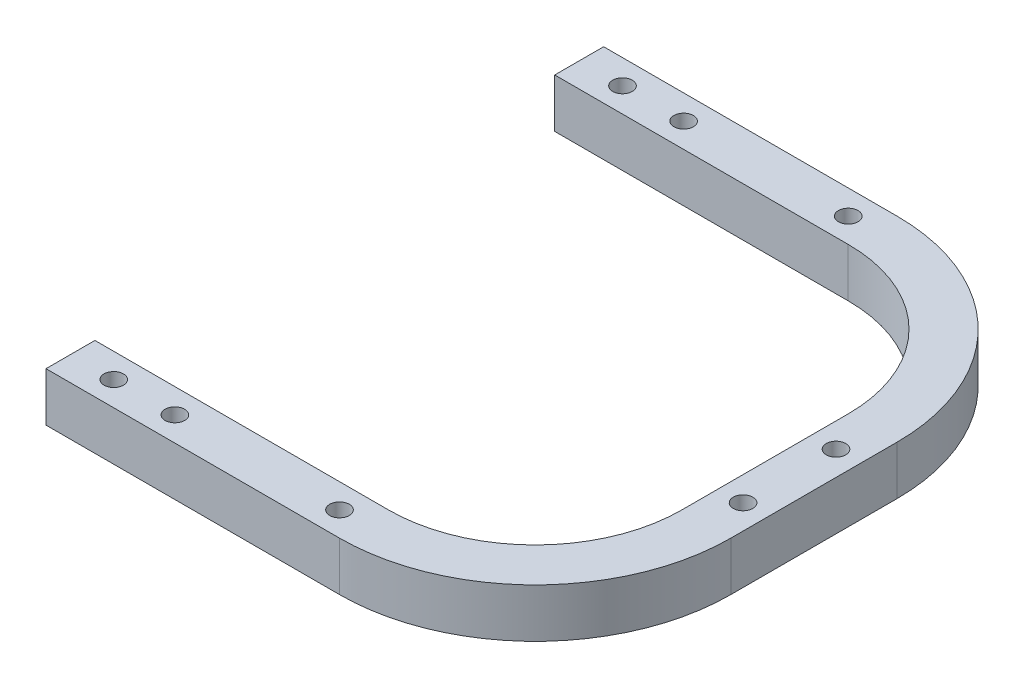
ISO-10303-21;
HEADER;
FILE_DESCRIPTION(('STEP AP214'),'2;1');
FILE_NAME('part.step','',(''),(''),'','','');
FILE_SCHEMA(('AUTOMOTIVE_DESIGN { 1 0 10303 214 1 1 1 1 }'));
ENDSEC;
DATA;
#1=APPLICATION_CONTEXT('core data for automotive mechanical design processes');
#2=APPLICATION_PROTOCOL_DEFINITION('international standard','automotive_design',2000,#1);
#3=PRODUCT_CONTEXT('',#1,'mechanical');
#4=PRODUCT('Part','Part','',(#3));
#5=PRODUCT_RELATED_PRODUCT_CATEGORY('part','',(#4));
#6=PRODUCT_DEFINITION_FORMATION('','',#4);
#7=PRODUCT_DEFINITION_CONTEXT('part definition',#1,'design');
#8=PRODUCT_DEFINITION('design','',#6,#7);
#9=PRODUCT_DEFINITION_SHAPE('','',#8);
#10=(LENGTH_UNIT() NAMED_UNIT(*) SI_UNIT(.MILLI.,.METRE.));
#11=(NAMED_UNIT(*) PLANE_ANGLE_UNIT() SI_UNIT($,.RADIAN.));
#12=(NAMED_UNIT(*) SI_UNIT($,.STERADIAN.) SOLID_ANGLE_UNIT());
#13=UNCERTAINTY_MEASURE_WITH_UNIT(LENGTH_MEASURE(1.E-05),#10,'distance_accuracy_value','');
#14=(GEOMETRIC_REPRESENTATION_CONTEXT(3) GLOBAL_UNCERTAINTY_ASSIGNED_CONTEXT((#13)) GLOBAL_UNIT_ASSIGNED_CONTEXT((#10,
#11,#12)) REPRESENTATION_CONTEXT('',''));
#15=CARTESIAN_POINT('',(0.,0.,0.));
#16=DIRECTION('',(0.,0.,1.));
#17=DIRECTION('',(1.,0.,0.));
#18=AXIS2_PLACEMENT_3D('',#15,#16,#17);
#19=CARTESIAN_POINT('',(20.,10.,-17.));
#20=DIRECTION('',(0.,-1.,0.));
#21=DIRECTION('',(0.,0.,-1.));
#22=AXIS2_PLACEMENT_3D('',#19,#20,#21);
#23=PLANE('',#22);
#24=CARTESIAN_POINT('',(20.,10.,-17.));
#25=DIRECTION('',(0.,-1.,0.));
#26=DIRECTION('',(0.,0.,-1.));
#27=AXIS2_PLACEMENT_3D('',#24,#25,#26);
#28=CIRCLE('',#27,30.);
#29=CARTESIAN_POINT('',(20.,10.,-47.));
#30=VERTEX_POINT('',#29);
#31=CARTESIAN_POINT('',(50.,10.,-17.));
#32=VERTEX_POINT('',#31);
#33=EDGE_CURVE('E176',#30,#32,#28,.T.);
#34=ORIENTED_EDGE('',*,*,#33,.T.);
#35=DIRECTION('',(0.,0.,1.));
#36=VECTOR('',#35,1.);
#37=CARTESIAN_POINT('',(50.,10.,-17.));
#38=LINE('',#37,#36);
#39=CARTESIAN_POINT('',(50.,10.,17.));
#40=VERTEX_POINT('',#39);
#41=EDGE_CURVE('E104',#32,#40,#38,.T.);
#42=ORIENTED_EDGE('',*,*,#41,.T.);
#43=CARTESIAN_POINT('',(20.,10.,17.));
#44=DIRECTION('',(0.,-1.,0.));
#45=DIRECTION('',(0.,0.,1.));
#46=AXIS2_PLACEMENT_3D('',#43,#44,#45);
#47=CIRCLE('',#46,30.);
#48=CARTESIAN_POINT('',(20.,10.,47.));
#49=VERTEX_POINT('',#48);
#50=EDGE_CURVE('E203',#40,#49,#47,.T.);
#51=ORIENTED_EDGE('',*,*,#50,.T.);
#52=DIRECTION('',(-1.,0.,0.));
#53=VECTOR('',#52,1.);
#54=CARTESIAN_POINT('',(20.,10.,47.));
#55=LINE('',#54,#53);
#56=CARTESIAN_POINT('',(-40.,10.,47.));
#57=VERTEX_POINT('',#56);
#58=EDGE_CURVE('E222',#49,#57,#55,.T.);
#59=ORIENTED_EDGE('',*,*,#58,.T.);
#60=DIRECTION('',(0.,0.,1.));
#61=VECTOR('',#60,1.);
#62=CARTESIAN_POINT('',(-40.,10.,47.));
#63=LINE('',#62,#61);
#64=CARTESIAN_POINT('',(-40.,10.,57.));
#65=VERTEX_POINT('',#64);
#66=EDGE_CURVE('E219',#57,#65,#63,.T.);
#67=ORIENTED_EDGE('',*,*,#66,.T.);
#68=DIRECTION('',(1.,0.,0.));
#69=VECTOR('',#68,1.);
#70=CARTESIAN_POINT('',(-40.,10.,57.));
#71=LINE('',#70,#69);
#72=CARTESIAN_POINT('',(20.,10.,57.));
#73=VERTEX_POINT('',#72);
#74=EDGE_CURVE('E221',#65,#73,#71,.T.);
#75=ORIENTED_EDGE('',*,*,#74,.T.);
#76=CARTESIAN_POINT('',(20.,10.,17.));
#77=DIRECTION('',(0.,1.,0.));
#78=DIRECTION('',(0.,0.,1.));
#79=AXIS2_PLACEMENT_3D('',#76,#77,#78);
#80=CIRCLE('',#79,40.);
#81=CARTESIAN_POINT('',(60.,10.,17.));
#82=VERTEX_POINT('',#81);
#83=EDGE_CURVE('E224',#73,#82,#80,.T.);
#84=ORIENTED_EDGE('',*,*,#83,.T.);
#85=DIRECTION('',(0.,0.,-1.));
#86=VECTOR('',#85,1.);
#87=CARTESIAN_POINT('',(60.,10.,-17.));
#88=LINE('',#87,#86);
#89=CARTESIAN_POINT('',(60.,10.,-17.));
#90=VERTEX_POINT('',#89);
#91=EDGE_CURVE('E230',#82,#90,#88,.T.);
#92=ORIENTED_EDGE('',*,*,#91,.T.);
#93=CARTESIAN_POINT('',(20.,10.,-17.));
#94=DIRECTION('',(0.,1.,0.));
#95=DIRECTION('',(0.,0.,-1.));
#96=AXIS2_PLACEMENT_3D('',#93,#94,#95);
#97=CIRCLE('',#96,40.);
#98=CARTESIAN_POINT('',(20.,10.,-57.));
#99=VERTEX_POINT('',#98);
#100=EDGE_CURVE('E135',#90,#99,#97,.T.);
#101=ORIENTED_EDGE('',*,*,#100,.T.);
#102=DIRECTION('',(-1.,0.,0.));
#103=VECTOR('',#102,1.);
#104=CARTESIAN_POINT('',(-40.,10.,-57.));
#105=LINE('',#104,#103);
#106=CARTESIAN_POINT('',(-40.,10.,-57.));
#107=VERTEX_POINT('',#106);
#108=EDGE_CURVE('E129',#99,#107,#105,.T.);
#109=ORIENTED_EDGE('',*,*,#108,.T.);
#110=DIRECTION('',(0.,0.,1.));
#111=VECTOR('',#110,1.);
#112=CARTESIAN_POINT('',(-40.,10.,-47.));
#113=LINE('',#112,#111);
#114=CARTESIAN_POINT('',(-40.,10.,-47.));
#115=VERTEX_POINT('',#114);
#116=EDGE_CURVE('E133',#107,#115,#113,.T.);
#117=ORIENTED_EDGE('',*,*,#116,.T.);
#118=DIRECTION('',(1.,0.,0.));
#119=VECTOR('',#118,1.);
#120=CARTESIAN_POINT('',(20.,10.,-47.));
#121=LINE('',#120,#119);
#122=EDGE_CURVE('E49',#115,#30,#121,.T.);
#123=ORIENTED_EDGE('',*,*,#122,.T.);
#124=EDGE_LOOP('',(#34,#42,#51,#59,#67,#75,#84,#92,#101,#109,#117,#123));
#125=FACE_BOUND('',#124,.T.);
#126=CARTESIAN_POINT('',(55.,10.,-9.5));
#127=DIRECTION('',(0.,1.,0.));
#128=DIRECTION('',(0.,0.,1.));
#129=AXIS2_PLACEMENT_3D('',#126,#127,#128);
#130=CIRCLE('',#129,2.);
#131=CARTESIAN_POINT('',(55.,10.,-7.5));
#132=VERTEX_POINT('',#131);
#133=EDGE_CURVE('E157',#132,#132,#130,.T.);
#134=ORIENTED_EDGE('',*,*,#133,.F.);
#135=EDGE_LOOP('',(#134));
#136=FACE_BOUND('',#135,.T.);
#137=CARTESIAN_POINT('',(55.,10.,9.5));
#138=DIRECTION('',(0.,1.,0.));
#139=DIRECTION('',(0.,0.,1.));
#140=AXIS2_PLACEMENT_3D('',#137,#138,#139);
#141=CIRCLE('',#140,2.);
#142=CARTESIAN_POINT('',(55.,10.,11.5));
#143=VERTEX_POINT('',#142);
#144=EDGE_CURVE('E334',#143,#143,#141,.T.);
#145=ORIENTED_EDGE('',*,*,#144,.F.);
#146=EDGE_LOOP('',(#145));
#147=FACE_BOUND('',#146,.T.);
#148=CARTESIAN_POINT('',(15.,10.,-52.));
#149=DIRECTION('',(0.,1.,0.));
#150=DIRECTION('',(0.,0.,1.));
#151=AXIS2_PLACEMENT_3D('',#148,#149,#150);
#152=CIRCLE('',#151,2.00000000000001);
#153=CARTESIAN_POINT('',(15.,10.,-50.));
#154=VERTEX_POINT('',#153);
#155=EDGE_CURVE('E328',#154,#154,#152,.T.);
#156=ORIENTED_EDGE('',*,*,#155,.F.);
#157=EDGE_LOOP('',(#156));
#158=FACE_BOUND('',#157,.T.);
#159=CARTESIAN_POINT('',(15.,10.,52.));
#160=DIRECTION('',(0.,1.,0.));
#161=DIRECTION('',(0.,0.,1.));
#162=AXIS2_PLACEMENT_3D('',#159,#160,#161);
#163=CIRCLE('',#162,2.00000000000001);
#164=CARTESIAN_POINT('',(15.,10.,54.));
#165=VERTEX_POINT('',#164);
#166=EDGE_CURVE('E322',#165,#165,#163,.T.);
#167=ORIENTED_EDGE('',*,*,#166,.F.);
#168=EDGE_LOOP('',(#167));
#169=FACE_BOUND('',#168,.T.);
#170=CARTESIAN_POINT('',(-18.6515131944612,10.,-51.9999999999808));
#171=DIRECTION('',(0.,1.,0.));
#172=DIRECTION('',(0.,0.,1.));
#173=AXIS2_PLACEMENT_3D('',#170,#171,#172);
#174=CIRCLE('',#173,2.);
#175=CARTESIAN_POINT('',(-18.6515131944612,10.,-49.9999999999807));
#176=VERTEX_POINT('',#175);
#177=EDGE_CURVE('E316',#176,#176,#174,.T.);
#178=ORIENTED_EDGE('',*,*,#177,.F.);
#179=EDGE_LOOP('',(#178));
#180=FACE_BOUND('',#179,.T.);
#181=CARTESIAN_POINT('',(-31.1515131944612,10.,-51.9999999999808));
#182=DIRECTION('',(0.,1.,0.));
#183=DIRECTION('',(0.,0.,1.));
#184=AXIS2_PLACEMENT_3D('',#181,#182,#183);
#185=CIRCLE('',#184,2.00000000000001);
#186=CARTESIAN_POINT('',(-31.1515131944612,10.,-49.9999999999807));
#187=VERTEX_POINT('',#186);
#188=EDGE_CURVE('E310',#187,#187,#185,.T.);
#189=ORIENTED_EDGE('',*,*,#188,.F.);
#190=EDGE_LOOP('',(#189));
#191=FACE_BOUND('',#190,.T.);
#192=CARTESIAN_POINT('',(-18.6515131944608,10.,52.0000000000006));
#193=DIRECTION('',(0.,1.,0.));
#194=DIRECTION('',(0.,0.,1.));
#195=AXIS2_PLACEMENT_3D('',#192,#193,#194);
#196=CIRCLE('',#195,2.00000000000001);
#197=CARTESIAN_POINT('',(-18.6515131944608,10.,54.0000000000006));
#198=VERTEX_POINT('',#197);
#199=EDGE_CURVE('E304',#198,#198,#196,.T.);
#200=ORIENTED_EDGE('',*,*,#199,.F.);
#201=EDGE_LOOP('',(#200));
#202=FACE_BOUND('',#201,.T.);
#203=CARTESIAN_POINT('',(-31.1515131944608,10.,52.0000000000006));
#204=DIRECTION('',(0.,1.,0.));
#205=DIRECTION('',(0.,0.,1.));
#206=AXIS2_PLACEMENT_3D('',#203,#204,#205);
#207=CIRCLE('',#206,2.00000000000001);
#208=CARTESIAN_POINT('',(-31.1515131944608,10.,54.0000000000006));
#209=VERTEX_POINT('',#208);
#210=EDGE_CURVE('E295',#209,#209,#207,.T.);
#211=ORIENTED_EDGE('',*,*,#210,.F.);
#212=EDGE_LOOP('',(#211));
#213=FACE_BOUND('',#212,.T.);
#214=ADVANCED_FACE('F32',(#125,#136,#147,#158,#169,#180,#191,#202,#213),#23,.F.);
#215=CARTESIAN_POINT('',(20.,0.,-17.));
#216=DIRECTION('',(0.,-1.,0.));
#217=DIRECTION('',(0.,0.,-1.));
#218=AXIS2_PLACEMENT_3D('',#215,#216,#217);
#219=PLANE('',#218);
#220=CARTESIAN_POINT('',(-18.6515131944608,0.,52.0000000000006));
#221=DIRECTION('',(0.,1.,0.));
#222=DIRECTION('',(0.,0.,1.));
#223=AXIS2_PLACEMENT_3D('',#220,#221,#222);
#224=CIRCLE('',#223,2.00000000000001);
#225=CARTESIAN_POINT('',(-18.6515131944608,0.,54.0000000000006));
#226=VERTEX_POINT('',#225);
#227=EDGE_CURVE('E301',#226,#226,#224,.T.);
#228=ORIENTED_EDGE('',*,*,#227,.T.);
#229=EDGE_LOOP('',(#228));
#230=FACE_BOUND('',#229,.T.);
#231=CARTESIAN_POINT('',(-18.6515131944612,0.,-51.9999999999808));
#232=DIRECTION('',(0.,1.,0.));
#233=DIRECTION('',(0.,0.,1.));
#234=AXIS2_PLACEMENT_3D('',#231,#232,#233);
#235=CIRCLE('',#234,2.);
#236=CARTESIAN_POINT('',(-18.6515131944612,0.,-49.9999999999807));
#237=VERTEX_POINT('',#236);
#238=EDGE_CURVE('E313',#237,#237,#235,.T.);
#239=ORIENTED_EDGE('',*,*,#238,.T.);
#240=EDGE_LOOP('',(#239));
#241=FACE_BOUND('',#240,.T.);
#242=CARTESIAN_POINT('',(15.,0.,-52.));
#243=DIRECTION('',(0.,1.,0.));
#244=DIRECTION('',(0.,0.,1.));
#245=AXIS2_PLACEMENT_3D('',#242,#243,#244);
#246=CIRCLE('',#245,2.00000000000001);
#247=CARTESIAN_POINT('',(15.,0.,-50.));
#248=VERTEX_POINT('',#247);
#249=EDGE_CURVE('E325',#248,#248,#246,.T.);
#250=ORIENTED_EDGE('',*,*,#249,.T.);
#251=EDGE_LOOP('',(#250));
#252=FACE_BOUND('',#251,.T.);
#253=CARTESIAN_POINT('',(55.,0.,-9.5));
#254=DIRECTION('',(0.,1.,0.));
#255=DIRECTION('',(0.,0.,1.));
#256=AXIS2_PLACEMENT_3D('',#253,#254,#255);
#257=CIRCLE('',#256,2.);
#258=CARTESIAN_POINT('',(55.,0.,-7.5));
#259=VERTEX_POINT('',#258);
#260=EDGE_CURVE('E337',#259,#259,#257,.T.);
#261=ORIENTED_EDGE('',*,*,#260,.T.);
#262=EDGE_LOOP('',(#261));
#263=FACE_BOUND('',#262,.T.);
#264=CARTESIAN_POINT('',(20.,0.,-17.));
#265=DIRECTION('',(0.,-1.,0.));
#266=DIRECTION('',(0.,0.,-1.));
#267=AXIS2_PLACEMENT_3D('',#264,#265,#266);
#268=CIRCLE('',#267,30.);
#269=CARTESIAN_POINT('',(20.,0.,-47.));
#270=VERTEX_POINT('',#269);
#271=CARTESIAN_POINT('',(50.,0.,-17.));
#272=VERTEX_POINT('',#271);
#273=EDGE_CURVE('E153',#270,#272,#268,.T.);
#274=ORIENTED_EDGE('',*,*,#273,.F.);
#275=DIRECTION('',(1.,0.,0.));
#276=VECTOR('',#275,1.);
#277=CARTESIAN_POINT('',(20.,0.,-47.));
#278=LINE('',#277,#276);
#279=CARTESIAN_POINT('',(-40.,0.,-47.));
#280=VERTEX_POINT('',#279);
#281=EDGE_CURVE('E96',#280,#270,#278,.T.);
#282=ORIENTED_EDGE('',*,*,#281,.F.);
#283=DIRECTION('',(0.,0.,1.));
#284=VECTOR('',#283,1.);
#285=CARTESIAN_POINT('',(-40.,0.,-47.));
#286=LINE('',#285,#284);
#287=CARTESIAN_POINT('',(-40.,0.,-57.));
#288=VERTEX_POINT('',#287);
#289=EDGE_CURVE('E90',#288,#280,#286,.T.);
#290=ORIENTED_EDGE('',*,*,#289,.F.);
#291=DIRECTION('',(-1.,0.,0.));
#292=VECTOR('',#291,1.);
#293=CARTESIAN_POINT('',(-40.,0.,-57.));
#294=LINE('',#293,#292);
#295=CARTESIAN_POINT('',(20.,0.,-57.));
#296=VERTEX_POINT('',#295);
#297=EDGE_CURVE('E143',#296,#288,#294,.T.);
#298=ORIENTED_EDGE('',*,*,#297,.F.);
#299=CARTESIAN_POINT('',(20.,0.,-17.));
#300=DIRECTION('',(0.,1.,0.));
#301=DIRECTION('',(0.,0.,-1.));
#302=AXIS2_PLACEMENT_3D('',#299,#300,#301);
#303=CIRCLE('',#302,40.);
#304=CARTESIAN_POINT('',(60.,0.,-17.));
#305=VERTEX_POINT('',#304);
#306=EDGE_CURVE('E171',#305,#296,#303,.T.);
#307=ORIENTED_EDGE('',*,*,#306,.F.);
#308=DIRECTION('',(0.,0.,-1.));
#309=VECTOR('',#308,1.);
#310=CARTESIAN_POINT('',(60.,0.,-17.));
#311=LINE('',#310,#309);
#312=CARTESIAN_POINT('',(60.,0.,17.));
#313=VERTEX_POINT('',#312);
#314=EDGE_CURVE('E169',#313,#305,#311,.T.);
#315=ORIENTED_EDGE('',*,*,#314,.F.);
#316=CARTESIAN_POINT('',(20.,0.,17.));
#317=DIRECTION('',(0.,1.,0.));
#318=DIRECTION('',(0.,0.,1.));
#319=AXIS2_PLACEMENT_3D('',#316,#317,#318);
#320=CIRCLE('',#319,40.);
#321=CARTESIAN_POINT('',(20.,0.,57.));
#322=VERTEX_POINT('',#321);
#323=EDGE_CURVE('E167',#322,#313,#320,.T.);
#324=ORIENTED_EDGE('',*,*,#323,.F.);
#325=DIRECTION('',(1.,0.,0.));
#326=VECTOR('',#325,1.);
#327=CARTESIAN_POINT('',(-40.,0.,57.));
#328=LINE('',#327,#326);
#329=CARTESIAN_POINT('',(-40.,0.,57.));
#330=VERTEX_POINT('',#329);
#331=EDGE_CURVE('E165',#330,#322,#328,.T.);
#332=ORIENTED_EDGE('',*,*,#331,.F.);
#333=DIRECTION('',(0.,0.,1.));
#334=VECTOR('',#333,1.);
#335=CARTESIAN_POINT('',(-40.,0.,47.));
#336=LINE('',#335,#334);
#337=CARTESIAN_POINT('',(-40.,0.,47.));
#338=VERTEX_POINT('',#337);
#339=EDGE_CURVE('E163',#338,#330,#336,.T.);
#340=ORIENTED_EDGE('',*,*,#339,.F.);
#341=DIRECTION('',(-1.,0.,0.));
#342=VECTOR('',#341,1.);
#343=CARTESIAN_POINT('',(20.,0.,47.));
#344=LINE('',#343,#342);
#345=CARTESIAN_POINT('',(20.,0.,47.));
#346=VERTEX_POINT('',#345);
#347=EDGE_CURVE('E161',#346,#338,#344,.T.);
#348=ORIENTED_EDGE('',*,*,#347,.F.);
#349=CARTESIAN_POINT('',(20.,0.,17.));
#350=DIRECTION('',(0.,-1.,0.));
#351=DIRECTION('',(0.,0.,1.));
#352=AXIS2_PLACEMENT_3D('',#349,#350,#351);
#353=CIRCLE('',#352,30.);
#354=CARTESIAN_POINT('',(50.,0.,17.));
#355=VERTEX_POINT('',#354);
#356=EDGE_CURVE('E159',#355,#346,#353,.T.);
#357=ORIENTED_EDGE('',*,*,#356,.F.);
#358=DIRECTION('',(0.,0.,1.));
#359=VECTOR('',#358,1.);
#360=CARTESIAN_POINT('',(50.,0.,-17.));
#361=LINE('',#360,#359);
#362=EDGE_CURVE('E156',#272,#355,#361,.T.);
#363=ORIENTED_EDGE('',*,*,#362,.F.);
#364=EDGE_LOOP('',(#274,#282,#290,#298,#307,#315,#324,#332,#340,#348,#357,#363));
#365=FACE_BOUND('',#364,.T.);
#366=CARTESIAN_POINT('',(55.,0.,9.5));
#367=DIRECTION('',(0.,1.,0.));
#368=DIRECTION('',(0.,0.,1.));
#369=AXIS2_PLACEMENT_3D('',#366,#367,#368);
#370=CIRCLE('',#369,2.);
#371=CARTESIAN_POINT('',(55.,0.,11.5));
#372=VERTEX_POINT('',#371);
#373=EDGE_CURVE('E331',#372,#372,#370,.T.);
#374=ORIENTED_EDGE('',*,*,#373,.T.);
#375=EDGE_LOOP('',(#374));
#376=FACE_BOUND('',#375,.T.);
#377=CARTESIAN_POINT('',(15.,0.,52.));
#378=DIRECTION('',(0.,1.,0.));
#379=DIRECTION('',(0.,0.,1.));
#380=AXIS2_PLACEMENT_3D('',#377,#378,#379);
#381=CIRCLE('',#380,2.00000000000001);
#382=CARTESIAN_POINT('',(15.,0.,54.));
#383=VERTEX_POINT('',#382);
#384=EDGE_CURVE('E319',#383,#383,#381,.T.);
#385=ORIENTED_EDGE('',*,*,#384,.T.);
#386=EDGE_LOOP('',(#385));
#387=FACE_BOUND('',#386,.T.);
#388=CARTESIAN_POINT('',(-31.1515131944612,0.,-51.9999999999808));
#389=DIRECTION('',(0.,1.,0.));
#390=DIRECTION('',(0.,0.,1.));
#391=AXIS2_PLACEMENT_3D('',#388,#389,#390);
#392=CIRCLE('',#391,2.00000000000001);
#393=CARTESIAN_POINT('',(-31.1515131944612,0.,-49.9999999999807));
#394=VERTEX_POINT('',#393);
#395=EDGE_CURVE('E307',#394,#394,#392,.T.);
#396=ORIENTED_EDGE('',*,*,#395,.T.);
#397=EDGE_LOOP('',(#396));
#398=FACE_BOUND('',#397,.T.);
#399=CARTESIAN_POINT('',(-31.1515131944608,0.,52.0000000000006));
#400=DIRECTION('',(0.,1.,0.));
#401=DIRECTION('',(0.,0.,1.));
#402=AXIS2_PLACEMENT_3D('',#399,#400,#401);
#403=CIRCLE('',#402,2.00000000000001);
#404=CARTESIAN_POINT('',(-31.1515131944608,0.,54.0000000000006));
#405=VERTEX_POINT('',#404);
#406=EDGE_CURVE('E298',#405,#405,#403,.T.);
#407=ORIENTED_EDGE('',*,*,#406,.T.);
#408=EDGE_LOOP('',(#407));
#409=FACE_BOUND('',#408,.T.);
#410=ADVANCED_FACE('F207',(#230,#241,#252,#263,#365,#376,#387,#398,#409),#219,.T.);
#411=CARTESIAN_POINT('',(20.,10.,-17.));
#412=DIRECTION('',(0.,-1.,0.));
#413=DIRECTION('',(0.,0.,-1.));
#414=AXIS2_PLACEMENT_3D('',#411,#412,#413);
#415=CYLINDRICAL_SURFACE('',#414,30.);
#416=ORIENTED_EDGE('',*,*,#273,.T.);
#417=DIRECTION('',(0.,-1.,0.));
#418=VECTOR('',#417,1.);
#419=CARTESIAN_POINT('',(50.,10.,-17.));
#420=LINE('',#419,#418);
#421=EDGE_CURVE('E11',#32,#272,#420,.T.);
#422=ORIENTED_EDGE('',*,*,#421,.F.);
#423=ORIENTED_EDGE('',*,*,#33,.F.);
#424=DIRECTION('',(0.,-1.,0.));
#425=VECTOR('',#424,1.);
#426=CARTESIAN_POINT('',(20.,10.,-47.));
#427=LINE('',#426,#425);
#428=EDGE_CURVE('E149',#30,#270,#427,.T.);
#429=ORIENTED_EDGE('',*,*,#428,.T.);
#430=EDGE_LOOP('',(#416,#422,#423,#429));
#431=FACE_BOUND('',#430,.T.);
#432=ADVANCED_FACE('F34',(#431),#415,.F.);
#433=CARTESIAN_POINT('',(50.,10.,-17.));
#434=DIRECTION('',(1.,0.,0.));
#435=DIRECTION('',(0.,0.,-1.));
#436=AXIS2_PLACEMENT_3D('',#433,#434,#435);
#437=PLANE('',#436);
#438=ORIENTED_EDGE('',*,*,#362,.T.);
#439=DIRECTION('',(0.,-1.,0.));
#440=VECTOR('',#439,1.);
#441=CARTESIAN_POINT('',(50.,10.,17.));
#442=LINE('',#441,#440);
#443=EDGE_CURVE('E41',#40,#355,#442,.T.);
#444=ORIENTED_EDGE('',*,*,#443,.F.);
#445=ORIENTED_EDGE('',*,*,#41,.F.);
#446=ORIENTED_EDGE('',*,*,#421,.T.);
#447=EDGE_LOOP('',(#438,#444,#445,#446));
#448=FACE_BOUND('',#447,.T.);
#449=ADVANCED_FACE('F485',(#448),#437,.F.);
#450=CARTESIAN_POINT('',(20.,10.,17.));
#451=DIRECTION('',(0.,-1.,0.));
#452=DIRECTION('',(0.,0.,-1.));
#453=AXIS2_PLACEMENT_3D('',#450,#451,#452);
#454=CYLINDRICAL_SURFACE('',#453,30.);
#455=ORIENTED_EDGE('',*,*,#356,.T.);
#456=DIRECTION('',(0.,-1.,0.));
#457=VECTOR('',#456,1.);
#458=CARTESIAN_POINT('',(20.,10.,47.));
#459=LINE('',#458,#457);
#460=EDGE_CURVE('E195',#49,#346,#459,.T.);
#461=ORIENTED_EDGE('',*,*,#460,.F.);
#462=ORIENTED_EDGE('',*,*,#50,.F.);
#463=ORIENTED_EDGE('',*,*,#443,.T.);
#464=EDGE_LOOP('',(#455,#461,#462,#463));
#465=FACE_BOUND('',#464,.T.);
#466=ADVANCED_FACE('F201',(#465),#454,.F.);
#467=CARTESIAN_POINT('',(20.,10.,47.));
#468=DIRECTION('',(0.,0.,1.));
#469=DIRECTION('',(1.,0.,0.));
#470=AXIS2_PLACEMENT_3D('',#467,#468,#469);
#471=PLANE('',#470);
#472=ORIENTED_EDGE('',*,*,#347,.T.);
#473=DIRECTION('',(0.,-1.,0.));
#474=VECTOR('',#473,1.);
#475=CARTESIAN_POINT('',(-40.,10.,47.));
#476=LINE('',#475,#474);
#477=EDGE_CURVE('E192',#57,#338,#476,.T.);
#478=ORIENTED_EDGE('',*,*,#477,.F.);
#479=ORIENTED_EDGE('',*,*,#58,.F.);
#480=ORIENTED_EDGE('',*,*,#460,.T.);
#481=EDGE_LOOP('',(#472,#478,#479,#480));
#482=FACE_BOUND('',#481,.T.);
#483=ADVANCED_FACE('F213',(#482),#471,.F.);
#484=CARTESIAN_POINT('',(-40.,10.,47.));
#485=DIRECTION('',(1.,0.,0.));
#486=DIRECTION('',(0.,0.,-1.));
#487=AXIS2_PLACEMENT_3D('',#484,#485,#486);
#488=PLANE('',#487);
#489=ORIENTED_EDGE('',*,*,#339,.T.);
#490=DIRECTION('',(0.,-1.,0.));
#491=VECTOR('',#490,1.);
#492=CARTESIAN_POINT('',(-40.,10.,57.));
#493=LINE('',#492,#491);
#494=EDGE_CURVE('E189',#65,#330,#493,.T.);
#495=ORIENTED_EDGE('',*,*,#494,.F.);
#496=ORIENTED_EDGE('',*,*,#66,.F.);
#497=ORIENTED_EDGE('',*,*,#477,.T.);
#498=EDGE_LOOP('',(#489,#495,#496,#497));
#499=FACE_BOUND('',#498,.T.);
#500=ADVANCED_FACE('F217',(#499),#488,.F.);
#501=CARTESIAN_POINT('',(-40.,10.,57.));
#502=DIRECTION('',(0.,0.,-1.));
#503=DIRECTION('',(-1.,0.,0.));
#504=AXIS2_PLACEMENT_3D('',#501,#502,#503);
#505=PLANE('',#504);
#506=ORIENTED_EDGE('',*,*,#331,.T.);
#507=DIRECTION('',(0.,-1.,0.));
#508=VECTOR('',#507,1.);
#509=CARTESIAN_POINT('',(20.,10.,57.));
#510=LINE('',#509,#508);
#511=EDGE_CURVE('E186',#73,#322,#510,.T.);
#512=ORIENTED_EDGE('',*,*,#511,.F.);
#513=ORIENTED_EDGE('',*,*,#74,.F.);
#514=ORIENTED_EDGE('',*,*,#494,.T.);
#515=EDGE_LOOP('',(#506,#512,#513,#514));
#516=FACE_BOUND('',#515,.T.);
#517=ADVANCED_FACE('F450',(#516),#505,.F.);
#518=CARTESIAN_POINT('',(20.,10.,17.));
#519=DIRECTION('',(0.,-1.,0.));
#520=DIRECTION('',(0.,0.,-1.));
#521=AXIS2_PLACEMENT_3D('',#518,#519,#520);
#522=CYLINDRICAL_SURFACE('',#521,40.);
#523=ORIENTED_EDGE('',*,*,#323,.T.);
#524=DIRECTION('',(0.,-1.,0.));
#525=VECTOR('',#524,1.);
#526=CARTESIAN_POINT('',(60.,10.,17.));
#527=LINE('',#526,#525);
#528=EDGE_CURVE('E183',#82,#313,#527,.T.);
#529=ORIENTED_EDGE('',*,*,#528,.F.);
#530=ORIENTED_EDGE('',*,*,#83,.F.);
#531=ORIENTED_EDGE('',*,*,#511,.T.);
#532=EDGE_LOOP('',(#523,#529,#530,#531));
#533=FACE_BOUND('',#532,.T.);
#534=ADVANCED_FACE('F441',(#533),#522,.T.);
#535=CARTESIAN_POINT('',(60.,10.,-17.));
#536=DIRECTION('',(-1.,0.,0.));
#537=DIRECTION('',(0.,0.,1.));
#538=AXIS2_PLACEMENT_3D('',#535,#536,#537);
#539=PLANE('',#538);
#540=ORIENTED_EDGE('',*,*,#314,.T.);
#541=DIRECTION('',(0.,-1.,0.));
#542=VECTOR('',#541,1.);
#543=CARTESIAN_POINT('',(60.,10.,-17.));
#544=LINE('',#543,#542);
#545=EDGE_CURVE('E180',#90,#305,#544,.T.);
#546=ORIENTED_EDGE('',*,*,#545,.F.);
#547=ORIENTED_EDGE('',*,*,#91,.F.);
#548=ORIENTED_EDGE('',*,*,#528,.T.);
#549=EDGE_LOOP('',(#540,#546,#547,#548));
#550=FACE_BOUND('',#549,.T.);
#551=ADVANCED_FACE('F236',(#550),#539,.F.);
#552=CARTESIAN_POINT('',(20.,10.,-17.));
#553=DIRECTION('',(0.,-1.,0.));
#554=DIRECTION('',(0.,0.,-1.));
#555=AXIS2_PLACEMENT_3D('',#552,#553,#554);
#556=CYLINDRICAL_SURFACE('',#555,40.);
#557=ORIENTED_EDGE('',*,*,#306,.T.);
#558=DIRECTION('',(0.,-1.,0.));
#559=VECTOR('',#558,1.);
#560=CARTESIAN_POINT('',(20.,10.,-57.));
#561=LINE('',#560,#559);
#562=EDGE_CURVE('E144',#99,#296,#561,.T.);
#563=ORIENTED_EDGE('',*,*,#562,.F.);
#564=ORIENTED_EDGE('',*,*,#100,.F.);
#565=ORIENTED_EDGE('',*,*,#545,.T.);
#566=EDGE_LOOP('',(#557,#563,#564,#565));
#567=FACE_BOUND('',#566,.T.);
#568=ADVANCED_FACE('F240',(#567),#556,.T.);
#569=CARTESIAN_POINT('',(-40.,10.,-57.));
#570=DIRECTION('',(0.,0.,1.));
#571=DIRECTION('',(1.,0.,0.));
#572=AXIS2_PLACEMENT_3D('',#569,#570,#571);
#573=PLANE('',#572);
#574=ORIENTED_EDGE('',*,*,#297,.T.);
#575=DIRECTION('',(0.,-1.,0.));
#576=VECTOR('',#575,1.);
#577=CARTESIAN_POINT('',(-40.,10.,-57.));
#578=LINE('',#577,#576);
#579=EDGE_CURVE('E140',#107,#288,#578,.T.);
#580=ORIENTED_EDGE('',*,*,#579,.F.);
#581=ORIENTED_EDGE('',*,*,#108,.F.);
#582=ORIENTED_EDGE('',*,*,#562,.T.);
#583=EDGE_LOOP('',(#574,#580,#581,#582));
#584=FACE_BOUND('',#583,.T.);
#585=ADVANCED_FACE('F141',(#584),#573,.F.);
#586=CARTESIAN_POINT('',(-40.,10.,-47.));
#587=DIRECTION('',(1.,0.,0.));
#588=DIRECTION('',(0.,0.,-1.));
#589=AXIS2_PLACEMENT_3D('',#586,#587,#588);
#590=PLANE('',#589);
#591=ORIENTED_EDGE('',*,*,#289,.T.);
#592=DIRECTION('',(0.,-1.,0.));
#593=VECTOR('',#592,1.);
#594=CARTESIAN_POINT('',(-40.,10.,-47.));
#595=LINE('',#594,#593);
#596=EDGE_CURVE('E145',#115,#280,#595,.T.);
#597=ORIENTED_EDGE('',*,*,#596,.F.);
#598=ORIENTED_EDGE('',*,*,#116,.F.);
#599=ORIENTED_EDGE('',*,*,#579,.T.);
#600=EDGE_LOOP('',(#591,#597,#598,#599));
#601=FACE_BOUND('',#600,.T.);
#602=ADVANCED_FACE('F147',(#601),#590,.F.);
#603=CARTESIAN_POINT('',(20.,10.,-47.));
#604=DIRECTION('',(0.,0.,-1.));
#605=DIRECTION('',(-1.,0.,0.));
#606=AXIS2_PLACEMENT_3D('',#603,#604,#605);
#607=PLANE('',#606);
#608=ORIENTED_EDGE('',*,*,#281,.T.);
#609=ORIENTED_EDGE('',*,*,#428,.F.);
#610=ORIENTED_EDGE('',*,*,#122,.F.);
#611=ORIENTED_EDGE('',*,*,#596,.T.);
#612=EDGE_LOOP('',(#608,#609,#610,#611));
#613=FACE_BOUND('',#612,.T.);
#614=ADVANCED_FACE('F244',(#613),#607,.F.);
#615=CARTESIAN_POINT('',(55.,10.,-9.5));
#616=DIRECTION('',(0.,-1.,0.));
#617=DIRECTION('',(0.,0.,-1.));
#618=AXIS2_PLACEMENT_3D('',#615,#616,#617);
#619=CYLINDRICAL_SURFACE('',#618,2.);
#620=ORIENTED_EDGE('',*,*,#133,.T.);
#621=EDGE_LOOP('',(#620));
#622=FACE_BOUND('',#621,.T.);
#623=ORIENTED_EDGE('',*,*,#260,.F.);
#624=EDGE_LOOP('',(#623));
#625=FACE_BOUND('',#624,.T.);
#626=ADVANCED_FACE('F246',(#622,#625),#619,.F.);
#627=CARTESIAN_POINT('',(55.,10.,9.5));
#628=DIRECTION('',(0.,-1.,0.));
#629=DIRECTION('',(0.,0.,-1.));
#630=AXIS2_PLACEMENT_3D('',#627,#628,#629);
#631=CYLINDRICAL_SURFACE('',#630,2.);
#632=ORIENTED_EDGE('',*,*,#144,.T.);
#633=EDGE_LOOP('',(#632));
#634=FACE_BOUND('',#633,.T.);
#635=ORIENTED_EDGE('',*,*,#373,.F.);
#636=EDGE_LOOP('',(#635));
#637=FACE_BOUND('',#636,.T.);
#638=ADVANCED_FACE('F252',(#634,#637),#631,.F.);
#639=CARTESIAN_POINT('',(15.,10.,-52.));
#640=DIRECTION('',(0.,-1.,0.));
#641=DIRECTION('',(0.,0.,-1.));
#642=AXIS2_PLACEMENT_3D('',#639,#640,#641);
#643=CYLINDRICAL_SURFACE('',#642,2.00000000000001);
#644=ORIENTED_EDGE('',*,*,#155,.T.);
#645=EDGE_LOOP('',(#644));
#646=FACE_BOUND('',#645,.T.);
#647=ORIENTED_EDGE('',*,*,#249,.F.);
#648=EDGE_LOOP('',(#647));
#649=FACE_BOUND('',#648,.T.);
#650=ADVANCED_FACE('F266',(#646,#649),#643,.F.);
#651=CARTESIAN_POINT('',(15.,10.,52.));
#652=DIRECTION('',(0.,-1.,0.));
#653=DIRECTION('',(0.,0.,-1.));
#654=AXIS2_PLACEMENT_3D('',#651,#652,#653);
#655=CYLINDRICAL_SURFACE('',#654,2.00000000000001);
#656=ORIENTED_EDGE('',*,*,#166,.T.);
#657=EDGE_LOOP('',(#656));
#658=FACE_BOUND('',#657,.T.);
#659=ORIENTED_EDGE('',*,*,#384,.F.);
#660=EDGE_LOOP('',(#659));
#661=FACE_BOUND('',#660,.T.);
#662=ADVANCED_FACE('F270',(#658,#661),#655,.F.);
#663=CARTESIAN_POINT('',(-18.6515131944612,10.,-51.9999999999808));
#664=DIRECTION('',(0.,-1.,0.));
#665=DIRECTION('',(0.,0.,-1.));
#666=AXIS2_PLACEMENT_3D('',#663,#664,#665);
#667=CYLINDRICAL_SURFACE('',#666,2.);
#668=ORIENTED_EDGE('',*,*,#177,.T.);
#669=EDGE_LOOP('',(#668));
#670=FACE_BOUND('',#669,.T.);
#671=ORIENTED_EDGE('',*,*,#238,.F.);
#672=EDGE_LOOP('',(#671));
#673=FACE_BOUND('',#672,.T.);
#674=ADVANCED_FACE('F274',(#670,#673),#667,.F.);
#675=CARTESIAN_POINT('',(-31.1515131944612,10.,-51.9999999999808));
#676=DIRECTION('',(0.,-1.,0.));
#677=DIRECTION('',(0.,0.,-1.));
#678=AXIS2_PLACEMENT_3D('',#675,#676,#677);
#679=CYLINDRICAL_SURFACE('',#678,2.00000000000001);
#680=ORIENTED_EDGE('',*,*,#188,.T.);
#681=EDGE_LOOP('',(#680));
#682=FACE_BOUND('',#681,.T.);
#683=ORIENTED_EDGE('',*,*,#395,.F.);
#684=EDGE_LOOP('',(#683));
#685=FACE_BOUND('',#684,.T.);
#686=ADVANCED_FACE('F278',(#682,#685),#679,.F.);
#687=CARTESIAN_POINT('',(-18.6515131944608,10.,52.0000000000006));
#688=DIRECTION('',(0.,-1.,0.));
#689=DIRECTION('',(0.,0.,-1.));
#690=AXIS2_PLACEMENT_3D('',#687,#688,#689);
#691=CYLINDRICAL_SURFACE('',#690,2.00000000000001);
#692=ORIENTED_EDGE('',*,*,#199,.T.);
#693=EDGE_LOOP('',(#692));
#694=FACE_BOUND('',#693,.T.);
#695=ORIENTED_EDGE('',*,*,#227,.F.);
#696=EDGE_LOOP('',(#695));
#697=FACE_BOUND('',#696,.T.);
#698=ADVANCED_FACE('F282',(#694,#697),#691,.F.);
#699=CARTESIAN_POINT('',(-31.1515131944608,10.,52.0000000000006));
#700=DIRECTION('',(0.,-1.,0.));
#701=DIRECTION('',(0.,0.,-1.));
#702=AXIS2_PLACEMENT_3D('',#699,#700,#701);
#703=CYLINDRICAL_SURFACE('',#702,2.00000000000001);
#704=ORIENTED_EDGE('',*,*,#210,.T.);
#705=EDGE_LOOP('',(#704));
#706=FACE_BOUND('',#705,.T.);
#707=ORIENTED_EDGE('',*,*,#406,.F.);
#708=EDGE_LOOP('',(#707));
#709=FACE_BOUND('',#708,.T.);
#710=ADVANCED_FACE('F286',(#706,#709),#703,.F.);
#711=CLOSED_SHELL('',(#214,#410,#432,#449,#466,#483,#500,#517,#534,#551,#568,#585,#602,#614,
#626,#638,#650,#662,#674,#686,#698,#710));
#712=MANIFOLD_SOLID_BREP('B2',#711);
#713=ADVANCED_BREP_SHAPE_REPRESENTATION('',(#18,#712),#14);
#714=SHAPE_DEFINITION_REPRESENTATION(#9,#713);
ENDSEC;
END-ISO-10303-21;
